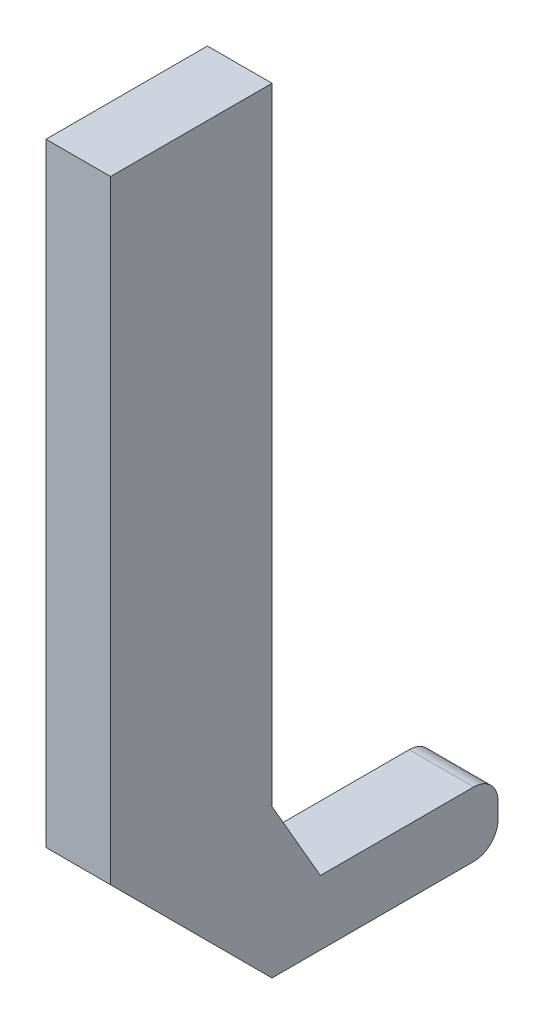
ISO-10303-21;
HEADER;
FILE_DESCRIPTION(('STEP AP214'),'2;1');
FILE_NAME('part.step','',(''),(''),'','','');
FILE_SCHEMA(('AUTOMOTIVE_DESIGN { 1 0 10303 214 1 1 1 1 }'));
ENDSEC;
DATA;
#1=APPLICATION_CONTEXT('core data for automotive mechanical design processes');
#2=APPLICATION_PROTOCOL_DEFINITION('international standard','automotive_design',2000,#1);
#3=PRODUCT_CONTEXT('',#1,'mechanical');
#4=PRODUCT('Part','Part','',(#3));
#5=PRODUCT_RELATED_PRODUCT_CATEGORY('part','',(#4));
#6=PRODUCT_DEFINITION_FORMATION('','',#4);
#7=PRODUCT_DEFINITION_CONTEXT('part definition',#1,'design');
#8=PRODUCT_DEFINITION('design','',#6,#7);
#9=PRODUCT_DEFINITION_SHAPE('','',#8);
#10=(LENGTH_UNIT() NAMED_UNIT(*) SI_UNIT(.MILLI.,.METRE.));
#11=(NAMED_UNIT(*) PLANE_ANGLE_UNIT() SI_UNIT($,.RADIAN.));
#12=(NAMED_UNIT(*) SI_UNIT($,.STERADIAN.) SOLID_ANGLE_UNIT());
#13=UNCERTAINTY_MEASURE_WITH_UNIT(LENGTH_MEASURE(1.E-05),#10,'distance_accuracy_value','');
#14=(GEOMETRIC_REPRESENTATION_CONTEXT(3) GLOBAL_UNCERTAINTY_ASSIGNED_CONTEXT((#13)) GLOBAL_UNIT_ASSIGNED_CONTEXT((#10,
#11,#12)) REPRESENTATION_CONTEXT('',''));
#15=CARTESIAN_POINT('',(0.,0.,0.));
#16=DIRECTION('',(0.,0.,1.));
#17=DIRECTION('',(1.,0.,0.));
#18=AXIS2_PLACEMENT_3D('',#15,#16,#17);
#19=CARTESIAN_POINT('',(-0.4,0.125,-0.625));
#20=DIRECTION('',(1.,0.,0.));
#21=DIRECTION('',(0.,1.,0.));
#22=AXIS2_PLACEMENT_3D('',#19,#20,#21);
#23=PLANE('',#22);
#24=CARTESIAN_POINT('',(-0.4,0.125,-0.625));
#25=DIRECTION('',(-1.,0.,0.));
#26=DIRECTION('',(0.,1.,0.));
#27=AXIS2_PLACEMENT_3D('',#24,#25,#26);
#28=CIRCLE('',#27,0.075);
#29=CARTESIAN_POINT('',(-0.4,0.2,-0.625));
#30=VERTEX_POINT('',#29);
#31=CARTESIAN_POINT('',(-0.4,0.125,-0.7));
#32=VERTEX_POINT('',#31);
#33=EDGE_CURVE('E157',#30,#32,#28,.T.);
#34=ORIENTED_EDGE('',*,*,#33,.F.);
#35=DIRECTION('',(0.,0.,-1.));
#36=VECTOR('',#35,1.);
#37=CARTESIAN_POINT('',(-0.4,0.2,-0.15));
#38=LINE('',#37,#36);
#39=CARTESIAN_POINT('',(-0.4,0.2,-0.15));
#40=VERTEX_POINT('',#39);
#41=EDGE_CURVE('E11',#40,#30,#38,.T.);
#42=ORIENTED_EDGE('',*,*,#41,.F.);
#43=DIRECTION('',(0.,-0.866025403784329,-0.50000000000019));
#44=VECTOR('',#43,1.);
#45=CARTESIAN_POINT('',(-0.4,0.459807621135,0.));
#46=LINE('',#45,#44);
#47=CARTESIAN_POINT('',(-0.4,0.459807621135,0.));
#48=VERTEX_POINT('',#47);
#49=EDGE_CURVE('E42',#48,#40,#46,.T.);
#50=ORIENTED_EDGE('',*,*,#49,.F.);
#51=DIRECTION('',(0.,-1.,0.));
#52=VECTOR('',#51,1.);
#53=CARTESIAN_POINT('',(-0.4,2.4,0.));
#54=LINE('',#53,#52);
#55=CARTESIAN_POINT('',(-0.4,2.4,0.));
#56=VERTEX_POINT('',#55);
#57=EDGE_CURVE('E210',#56,#48,#54,.T.);
#58=ORIENTED_EDGE('',*,*,#57,.F.);
#59=DIRECTION('',(0.,0.,-1.));
#60=VECTOR('',#59,1.);
#61=CARTESIAN_POINT('',(-0.4,2.4,0.5));
#62=LINE('',#61,#60);
#63=CARTESIAN_POINT('',(-0.4,2.4,0.5));
#64=VERTEX_POINT('',#63);
#65=EDGE_CURVE('E202',#64,#56,#62,.T.);
#66=ORIENTED_EDGE('',*,*,#65,.F.);
#67=DIRECTION('',(0.,1.,0.));
#68=VECTOR('',#67,1.);
#69=CARTESIAN_POINT('',(-0.4,0.5,0.5));
#70=LINE('',#69,#68);
#71=CARTESIAN_POINT('',(-0.4,0.5,0.5));
#72=VERTEX_POINT('',#71);
#73=EDGE_CURVE('E129',#72,#64,#70,.T.);
#74=ORIENTED_EDGE('',*,*,#73,.F.);
#75=DIRECTION('',(0.,0.707106781186548,0.707106781186548));
#76=VECTOR('',#75,1.);
#77=CARTESIAN_POINT('',(-0.4,0.,0.));
#78=LINE('',#77,#76);
#79=CARTESIAN_POINT('',(-0.4,0.,0.));
#80=VERTEX_POINT('',#79);
#81=EDGE_CURVE('E125',#80,#72,#78,.T.);
#82=ORIENTED_EDGE('',*,*,#81,.F.);
#83=DIRECTION('',(0.,0.,1.));
#84=VECTOR('',#83,1.);
#85=CARTESIAN_POINT('',(-0.4,0.,-0.625));
#86=LINE('',#85,#84);
#87=CARTESIAN_POINT('',(-0.4,0.,-0.625));
#88=VERTEX_POINT('',#87);
#89=EDGE_CURVE('E167',#88,#80,#86,.T.);
#90=ORIENTED_EDGE('',*,*,#89,.F.);
#91=CARTESIAN_POINT('',(-0.4,0.075,-0.625));
#92=DIRECTION('',(-1.,0.,0.));
#93=DIRECTION('',(0.,0.,-1.));
#94=AXIS2_PLACEMENT_3D('',#91,#92,#93);
#95=CIRCLE('',#94,0.075);
#96=CARTESIAN_POINT('',(-0.4,0.075,-0.7));
#97=VERTEX_POINT('',#96);
#98=EDGE_CURVE('E185',#97,#88,#95,.T.);
#99=ORIENTED_EDGE('',*,*,#98,.F.);
#100=DIRECTION('',(0.,-1.,0.));
#101=VECTOR('',#100,1.);
#102=CARTESIAN_POINT('',(-0.4,0.125,-0.7));
#103=LINE('',#102,#101);
#104=EDGE_CURVE('E181',#32,#97,#103,.T.);
#105=ORIENTED_EDGE('',*,*,#104,.F.);
#106=EDGE_LOOP('',(#34,#42,#50,#58,#66,#74,#82,#90,#99,#105));
#107=FACE_BOUND('',#106,.T.);
#108=ADVANCED_FACE('F17',(#107),#23,.T.);
#109=CARTESIAN_POINT('',(-0.4,0.2,-0.625));
#110=DIRECTION('',(0.,-1.,0.));
#111=DIRECTION('',(0.,0.,-1.));
#112=AXIS2_PLACEMENT_3D('',#109,#110,#111);
#113=PLANE('',#112);
#114=DIRECTION('',(0.,0.,-1.));
#115=VECTOR('',#114,1.);
#116=CARTESIAN_POINT('',(-0.6,0.2,-0.15));
#117=LINE('',#116,#115);
#118=CARTESIAN_POINT('',(-0.6,0.2,-0.15));
#119=VERTEX_POINT('',#118);
#120=CARTESIAN_POINT('',(-0.6,0.2,-0.625));
#121=VERTEX_POINT('',#120);
#122=EDGE_CURVE('E173',#119,#121,#117,.T.);
#123=ORIENTED_EDGE('',*,*,#122,.F.);
#124=DIRECTION('',(1.,0.,0.));
#125=VECTOR('',#124,1.);
#126=CARTESIAN_POINT('',(-0.6,0.2,-0.15));
#127=LINE('',#126,#125);
#128=EDGE_CURVE('E25',#119,#40,#127,.T.);
#129=ORIENTED_EDGE('',*,*,#128,.T.);
#130=ORIENTED_EDGE('',*,*,#41,.T.);
#131=DIRECTION('',(-1.,0.,0.));
#132=VECTOR('',#131,1.);
#133=CARTESIAN_POINT('',(-0.4,0.2,-0.625));
#134=LINE('',#133,#132);
#135=EDGE_CURVE('E170',#30,#121,#134,.T.);
#136=ORIENTED_EDGE('',*,*,#135,.T.);
#137=EDGE_LOOP('',(#123,#129,#130,#136));
#138=FACE_BOUND('',#137,.T.);
#139=ADVANCED_FACE('F223',(#138),#113,.F.);
#140=CARTESIAN_POINT('',(-0.4,0.2,-0.15));
#141=DIRECTION('',(0.,-0.50000000000019,0.866025403784329));
#142=DIRECTION('',(-1.,0.,0.));
#143=AXIS2_PLACEMENT_3D('',#140,#141,#142);
#144=PLANE('',#143);
#145=DIRECTION('',(0.,0.866025403784329,0.50000000000019));
#146=VECTOR('',#145,1.);
#147=CARTESIAN_POINT('',(-0.6,0.2,-0.15));
#148=LINE('',#147,#146);
#149=CARTESIAN_POINT('',(-0.6,0.459807621135,0.));
#150=VERTEX_POINT('',#149);
#151=EDGE_CURVE('E162',#119,#150,#148,.T.);
#152=ORIENTED_EDGE('',*,*,#151,.T.);
#153=DIRECTION('',(1.,0.,0.));
#154=VECTOR('',#153,1.);
#155=CARTESIAN_POINT('',(-0.6,0.459807621135,0.));
#156=LINE('',#155,#154);
#157=EDGE_CURVE('E214',#150,#48,#156,.T.);
#158=ORIENTED_EDGE('',*,*,#157,.T.);
#159=ORIENTED_EDGE('',*,*,#49,.T.);
#160=ORIENTED_EDGE('',*,*,#128,.F.);
#161=EDGE_LOOP('',(#152,#158,#159,#160));
#162=FACE_BOUND('',#161,.T.);
#163=ADVANCED_FACE('F227',(#162),#144,.F.);
#164=CARTESIAN_POINT('',(-0.4,0.459807621135,0.));
#165=DIRECTION('',(0.,0.,1.));
#166=DIRECTION('',(1.,0.,0.));
#167=AXIS2_PLACEMENT_3D('',#164,#165,#166);
#168=PLANE('',#167);
#169=DIRECTION('',(0.,-1.,0.));
#170=VECTOR('',#169,1.);
#171=CARTESIAN_POINT('',(-0.6,2.4,0.));
#172=LINE('',#171,#170);
#173=CARTESIAN_POINT('',(-0.6,2.4,0.));
#174=VERTEX_POINT('',#173);
#175=EDGE_CURVE('E159',#174,#150,#172,.T.);
#176=ORIENTED_EDGE('',*,*,#175,.F.);
#177=DIRECTION('',(1.,0.,0.));
#178=VECTOR('',#177,1.);
#179=CARTESIAN_POINT('',(-0.6,2.4,0.));
#180=LINE('',#179,#178);
#181=EDGE_CURVE('E206',#174,#56,#180,.T.);
#182=ORIENTED_EDGE('',*,*,#181,.T.);
#183=ORIENTED_EDGE('',*,*,#57,.T.);
#184=ORIENTED_EDGE('',*,*,#157,.F.);
#185=EDGE_LOOP('',(#176,#182,#183,#184));
#186=FACE_BOUND('',#185,.T.);
#187=ADVANCED_FACE('F230',(#186),#168,.F.);
#188=CARTESIAN_POINT('',(-0.4,2.4,0.));
#189=DIRECTION('',(0.,-1.,0.));
#190=DIRECTION('',(0.,0.,-1.));
#191=AXIS2_PLACEMENT_3D('',#188,#189,#190);
#192=PLANE('',#191);
#193=DIRECTION('',(0.,0.,-1.));
#194=VECTOR('',#193,1.);
#195=CARTESIAN_POINT('',(-0.6,2.4,0.5));
#196=LINE('',#195,#194);
#197=CARTESIAN_POINT('',(-0.6,2.4,0.5));
#198=VERTEX_POINT('',#197);
#199=EDGE_CURVE('E140',#198,#174,#196,.T.);
#200=ORIENTED_EDGE('',*,*,#199,.F.);
#201=DIRECTION('',(1.,0.,0.));
#202=VECTOR('',#201,1.);
#203=CARTESIAN_POINT('',(-0.6,2.4,0.5));
#204=LINE('',#203,#202);
#205=EDGE_CURVE('E135',#198,#64,#204,.T.);
#206=ORIENTED_EDGE('',*,*,#205,.T.);
#207=ORIENTED_EDGE('',*,*,#65,.T.);
#208=ORIENTED_EDGE('',*,*,#181,.F.);
#209=EDGE_LOOP('',(#200,#206,#207,#208));
#210=FACE_BOUND('',#209,.T.);
#211=ADVANCED_FACE('F232',(#210),#192,.F.);
#212=CARTESIAN_POINT('',(-0.4,2.4,0.5));
#213=DIRECTION('',(0.,0.,-1.));
#214=DIRECTION('',(0.,-1.,0.));
#215=AXIS2_PLACEMENT_3D('',#212,#213,#214);
#216=PLANE('',#215);
#217=DIRECTION('',(0.,1.,0.));
#218=VECTOR('',#217,1.);
#219=CARTESIAN_POINT('',(-0.6,0.5,0.5));
#220=LINE('',#219,#218);
#221=CARTESIAN_POINT('',(-0.6,0.5,0.5));
#222=VERTEX_POINT('',#221);
#223=EDGE_CURVE('E132',#222,#198,#220,.T.);
#224=ORIENTED_EDGE('',*,*,#223,.F.);
#225=DIRECTION('',(1.,0.,0.));
#226=VECTOR('',#225,1.);
#227=CARTESIAN_POINT('',(-0.6,0.5,0.5));
#228=LINE('',#227,#226);
#229=EDGE_CURVE('E118',#222,#72,#228,.T.);
#230=ORIENTED_EDGE('',*,*,#229,.T.);
#231=ORIENTED_EDGE('',*,*,#73,.T.);
#232=ORIENTED_EDGE('',*,*,#205,.F.);
#233=EDGE_LOOP('',(#224,#230,#231,#232));
#234=FACE_BOUND('',#233,.T.);
#235=ADVANCED_FACE('F133',(#234),#216,.F.);
#236=CARTESIAN_POINT('',(-0.4,0.5,0.5));
#237=DIRECTION('',(0.,0.707106781186548,-0.707106781186548));
#238=DIRECTION('',(-1.,0.,0.));
#239=AXIS2_PLACEMENT_3D('',#236,#237,#238);
#240=PLANE('',#239);
#241=DIRECTION('',(0.,-0.707106781186548,-0.707106781186548));
#242=VECTOR('',#241,1.);
#243=CARTESIAN_POINT('',(-0.6,0.5,0.5));
#244=LINE('',#243,#242);
#245=CARTESIAN_POINT('',(-0.6,0.,0.));
#246=VERTEX_POINT('',#245);
#247=EDGE_CURVE('E123',#222,#246,#244,.T.);
#248=ORIENTED_EDGE('',*,*,#247,.T.);
#249=DIRECTION('',(1.,0.,0.));
#250=VECTOR('',#249,1.);
#251=CARTESIAN_POINT('',(-0.6,0.,0.));
#252=LINE('',#251,#250);
#253=EDGE_CURVE('E164',#246,#80,#252,.T.);
#254=ORIENTED_EDGE('',*,*,#253,.T.);
#255=ORIENTED_EDGE('',*,*,#81,.T.);
#256=ORIENTED_EDGE('',*,*,#229,.F.);
#257=EDGE_LOOP('',(#248,#254,#255,#256));
#258=FACE_BOUND('',#257,.T.);
#259=ADVANCED_FACE('F120',(#258),#240,.F.);
#260=CARTESIAN_POINT('',(-0.4,0.,0.));
#261=DIRECTION('',(0.,1.,0.));
#262=DIRECTION('',(1.,0.,0.));
#263=AXIS2_PLACEMENT_3D('',#260,#261,#262);
#264=PLANE('',#263);
#265=DIRECTION('',(0.,0.,1.));
#266=VECTOR('',#265,1.);
#267=CARTESIAN_POINT('',(-0.6,0.,-0.625));
#268=LINE('',#267,#266);
#269=CARTESIAN_POINT('',(-0.6,0.,-0.625));
#270=VERTEX_POINT('',#269);
#271=EDGE_CURVE('E146',#270,#246,#268,.T.);
#272=ORIENTED_EDGE('',*,*,#271,.F.);
#273=DIRECTION('',(1.,0.,0.));
#274=VECTOR('',#273,1.);
#275=CARTESIAN_POINT('',(-0.6,0.,-0.625));
#276=LINE('',#275,#274);
#277=EDGE_CURVE('E189',#270,#88,#276,.T.);
#278=ORIENTED_EDGE('',*,*,#277,.T.);
#279=ORIENTED_EDGE('',*,*,#89,.T.);
#280=ORIENTED_EDGE('',*,*,#253,.F.);
#281=EDGE_LOOP('',(#272,#278,#279,#280));
#282=FACE_BOUND('',#281,.T.);
#283=ADVANCED_FACE('F261',(#282),#264,.F.);
#284=CARTESIAN_POINT('',(-0.4,0.075,-0.625));
#285=DIRECTION('',(-1.,0.,0.));
#286=DIRECTION('',(0.,0.,1.));
#287=AXIS2_PLACEMENT_3D('',#284,#285,#286);
#288=CYLINDRICAL_SURFACE('',#287,0.075);
#289=DIRECTION('',(-1.,0.,0.));
#290=VECTOR('',#289,1.);
#291=CARTESIAN_POINT('',(-0.4,0.075,-0.7));
#292=LINE('',#291,#290);
#293=CARTESIAN_POINT('',(-0.6,0.075,-0.7));
#294=VERTEX_POINT('',#293);
#295=EDGE_CURVE('E182',#97,#294,#292,.T.);
#296=ORIENTED_EDGE('',*,*,#295,.F.);
#297=ORIENTED_EDGE('',*,*,#98,.T.);
#298=ORIENTED_EDGE('',*,*,#277,.F.);
#299=CARTESIAN_POINT('',(-0.6,0.075,-0.625));
#300=DIRECTION('',(1.,0.,0.));
#301=DIRECTION('',(0.,-1.,0.));
#302=AXIS2_PLACEMENT_3D('',#299,#300,#301);
#303=CIRCLE('',#302,0.075);
#304=EDGE_CURVE('E153',#270,#294,#303,.T.);
#305=ORIENTED_EDGE('',*,*,#304,.T.);
#306=EDGE_LOOP('',(#296,#297,#298,#305));
#307=FACE_BOUND('',#306,.T.);
#308=ADVANCED_FACE('F254',(#307),#288,.T.);
#309=CARTESIAN_POINT('',(-0.4,0.075,-0.7));
#310=DIRECTION('',(0.,0.,1.));
#311=DIRECTION('',(1.,0.,0.));
#312=AXIS2_PLACEMENT_3D('',#309,#310,#311);
#313=PLANE('',#312);
#314=DIRECTION('',(0.,-1.,0.));
#315=VECTOR('',#314,1.);
#316=CARTESIAN_POINT('',(-0.6,0.125,-0.7));
#317=LINE('',#316,#315);
#318=CARTESIAN_POINT('',(-0.6,0.125,-0.7));
#319=VERTEX_POINT('',#318);
#320=EDGE_CURVE('E242',#319,#294,#317,.T.);
#321=ORIENTED_EDGE('',*,*,#320,.F.);
#322=DIRECTION('',(1.,0.,0.));
#323=VECTOR('',#322,1.);
#324=CARTESIAN_POINT('',(-0.6,0.125,-0.7));
#325=LINE('',#324,#323);
#326=EDGE_CURVE('E177',#319,#32,#325,.T.);
#327=ORIENTED_EDGE('',*,*,#326,.T.);
#328=ORIENTED_EDGE('',*,*,#104,.T.);
#329=ORIENTED_EDGE('',*,*,#295,.T.);
#330=EDGE_LOOP('',(#321,#327,#328,#329));
#331=FACE_BOUND('',#330,.T.);
#332=ADVANCED_FACE('F257',(#331),#313,.F.);
#333=CARTESIAN_POINT('',(-0.4,0.125,-0.625));
#334=DIRECTION('',(-1.,0.,0.));
#335=DIRECTION('',(0.,0.,1.));
#336=AXIS2_PLACEMENT_3D('',#333,#334,#335);
#337=CYLINDRICAL_SURFACE('',#336,0.075);
#338=ORIENTED_EDGE('',*,*,#135,.F.);
#339=ORIENTED_EDGE('',*,*,#33,.T.);
#340=ORIENTED_EDGE('',*,*,#326,.F.);
#341=CARTESIAN_POINT('',(-0.6,0.125,-0.625));
#342=DIRECTION('',(1.,0.,0.));
#343=DIRECTION('',(0.,0.,-1.));
#344=AXIS2_PLACEMENT_3D('',#341,#342,#343);
#345=CIRCLE('',#344,0.075);
#346=EDGE_CURVE('E239',#319,#121,#345,.T.);
#347=ORIENTED_EDGE('',*,*,#346,.T.);
#348=EDGE_LOOP('',(#338,#339,#340,#347));
#349=FACE_BOUND('',#348,.T.);
#350=ADVANCED_FACE('F284',(#349),#337,.T.);
#351=CARTESIAN_POINT('',(-0.6,0.125,-0.625));
#352=DIRECTION('',(1.,0.,0.));
#353=DIRECTION('',(0.,1.,0.));
#354=AXIS2_PLACEMENT_3D('',#351,#352,#353);
#355=PLANE('',#354);
#356=ORIENTED_EDGE('',*,*,#346,.F.);
#357=ORIENTED_EDGE('',*,*,#320,.T.);
#358=ORIENTED_EDGE('',*,*,#304,.F.);
#359=ORIENTED_EDGE('',*,*,#271,.T.);
#360=ORIENTED_EDGE('',*,*,#247,.F.);
#361=ORIENTED_EDGE('',*,*,#223,.T.);
#362=ORIENTED_EDGE('',*,*,#199,.T.);
#363=ORIENTED_EDGE('',*,*,#175,.T.);
#364=ORIENTED_EDGE('',*,*,#151,.F.);
#365=ORIENTED_EDGE('',*,*,#122,.T.);
#366=EDGE_LOOP('',(#356,#357,#358,#359,#360,#361,#362,#363,#364,#365));
#367=FACE_BOUND('',#366,.T.);
#368=ADVANCED_FACE('F143',(#367),#355,.F.);
#369=CLOSED_SHELL('',(#108,#139,#163,#187,#211,#235,#259,#283,#308,#332,#350,#368));
#370=MANIFOLD_SOLID_BREP('B1',#369);
#371=ADVANCED_BREP_SHAPE_REPRESENTATION('',(#18,#370),#14);
#372=SHAPE_DEFINITION_REPRESENTATION(#9,#371);
ENDSEC;
END-ISO-10303-21;
